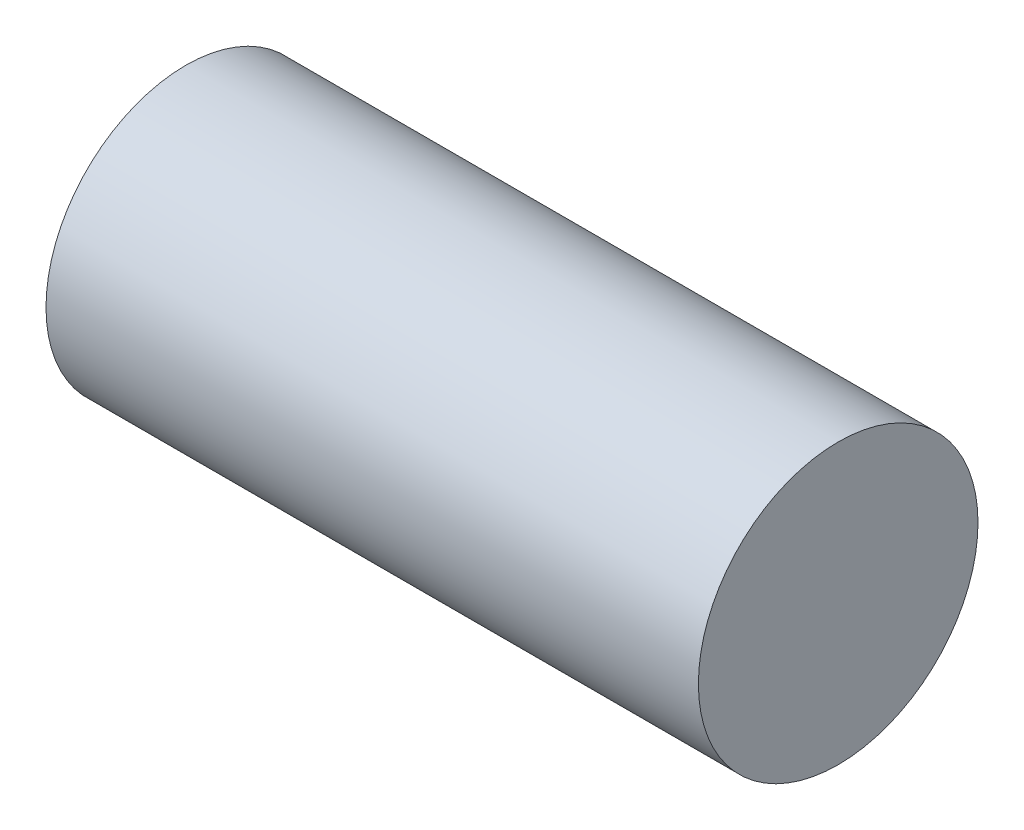
ISO-10303-21;
HEADER;
FILE_DESCRIPTION(('STEP AP214'),'2;1');
FILE_NAME('part.step','',(''),(''),'','','');
FILE_SCHEMA(('AUTOMOTIVE_DESIGN { 1 0 10303 214 1 1 1 1 }'));
ENDSEC;
DATA;
#1=APPLICATION_CONTEXT('core data for automotive mechanical design processes');
#2=APPLICATION_PROTOCOL_DEFINITION('international standard','automotive_design',2000,#1);
#3=PRODUCT_CONTEXT('',#1,'mechanical');
#4=PRODUCT('Part','Part','',(#3));
#5=PRODUCT_RELATED_PRODUCT_CATEGORY('part','',(#4));
#6=PRODUCT_DEFINITION_FORMATION('','',#4);
#7=PRODUCT_DEFINITION_CONTEXT('part definition',#1,'design');
#8=PRODUCT_DEFINITION('design','',#6,#7);
#9=PRODUCT_DEFINITION_SHAPE('','',#8);
#10=(LENGTH_UNIT() NAMED_UNIT(*) SI_UNIT(.MILLI.,.METRE.));
#11=(NAMED_UNIT(*) PLANE_ANGLE_UNIT() SI_UNIT($,.RADIAN.));
#12=(NAMED_UNIT(*) SI_UNIT($,.STERADIAN.) SOLID_ANGLE_UNIT());
#13=UNCERTAINTY_MEASURE_WITH_UNIT(LENGTH_MEASURE(1.E-05),#10,'distance_accuracy_value','');
#14=(GEOMETRIC_REPRESENTATION_CONTEXT(3) GLOBAL_UNCERTAINTY_ASSIGNED_CONTEXT((#13)) GLOBAL_UNIT_ASSIGNED_CONTEXT((#10,
#11,#12)) REPRESENTATION_CONTEXT('',''));
#15=CARTESIAN_POINT('',(0.,0.,0.));
#16=DIRECTION('',(0.,0.,1.));
#17=DIRECTION('',(1.,0.,0.));
#18=AXIS2_PLACEMENT_3D('',#15,#16,#17);
#19=CARTESIAN_POINT('',(7.,0.,0.));
#20=DIRECTION('',(-1.,0.,0.));
#21=DIRECTION('',(0.,0.,1.));
#22=AXIS2_PLACEMENT_3D('',#19,#20,#21);
#23=CYLINDRICAL_SURFACE('',#22,1.5);
#24=CARTESIAN_POINT('',(7.,0.,0.));
#25=DIRECTION('',(1.,0.,0.));
#26=DIRECTION('',(0.,0.,-1.));
#27=AXIS2_PLACEMENT_3D('',#24,#25,#26);
#28=CIRCLE('',#27,1.5);
#29=CARTESIAN_POINT('',(7.,0.,-1.5));
#30=VERTEX_POINT('',#29);
#31=EDGE_CURVE('E10',#30,#30,#28,.T.);
#32=ORIENTED_EDGE('',*,*,#31,.F.);
#33=EDGE_LOOP('',(#32));
#34=FACE_BOUND('',#33,.T.);
#35=CARTESIAN_POINT('',(0.,0.,0.));
#36=DIRECTION('',(1.,0.,0.));
#37=DIRECTION('',(0.,0.,-1.));
#38=AXIS2_PLACEMENT_3D('',#35,#36,#37);
#39=CIRCLE('',#38,1.5);
#40=CARTESIAN_POINT('',(0.,0.,-1.5));
#41=VERTEX_POINT('',#40);
#42=EDGE_CURVE('E36',#41,#41,#39,.T.);
#43=ORIENTED_EDGE('',*,*,#42,.T.);
#44=EDGE_LOOP('',(#43));
#45=FACE_BOUND('',#44,.T.);
#46=ADVANCED_FACE('F33',(#34,#45),#23,.T.);
#47=CARTESIAN_POINT('',(7.,0.,0.));
#48=DIRECTION('',(1.,0.,0.));
#49=DIRECTION('',(0.,0.,-1.));
#50=AXIS2_PLACEMENT_3D('',#47,#48,#49);
#51=PLANE('',#50);
#52=ORIENTED_EDGE('',*,*,#31,.T.);
#53=EDGE_LOOP('',(#52));
#54=FACE_BOUND('',#53,.T.);
#55=ADVANCED_FACE('F48',(#54),#51,.T.);
#56=CARTESIAN_POINT('',(0.,0.,0.));
#57=DIRECTION('',(1.,0.,0.));
#58=DIRECTION('',(0.,0.,-1.));
#59=AXIS2_PLACEMENT_3D('',#56,#57,#58);
#60=PLANE('',#59);
#61=ORIENTED_EDGE('',*,*,#42,.F.);
#62=EDGE_LOOP('',(#61));
#63=FACE_BOUND('',#62,.T.);
#64=ADVANCED_FACE('F46',(#63),#60,.F.);
#65=CLOSED_SHELL('',(#46,#55,#64));
#66=MANIFOLD_SOLID_BREP('B2',#65);
#67=ADVANCED_BREP_SHAPE_REPRESENTATION('',(#18,#66),#14);
#68=SHAPE_DEFINITION_REPRESENTATION(#9,#67);
ENDSEC;
END-ISO-10303-21;
